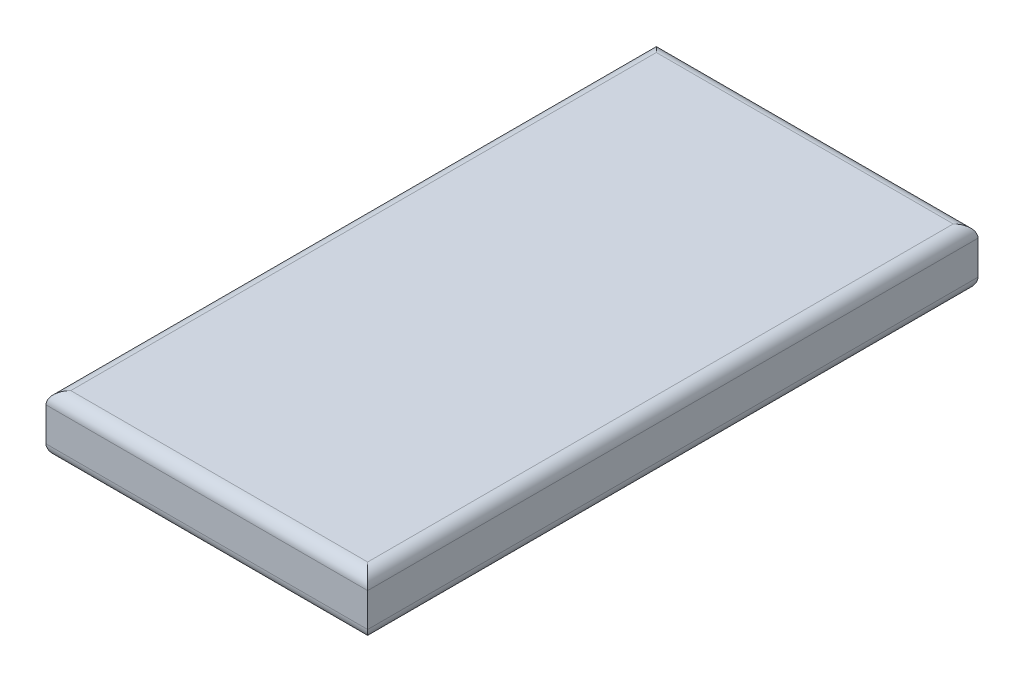
ISO-10303-21;
HEADER;
FILE_DESCRIPTION(('STEP AP214'),'2;1');
FILE_NAME('part.step','',(''),(''),'','','');
FILE_SCHEMA(('AUTOMOTIVE_DESIGN { 1 0 10303 214 1 1 1 1 }'));
ENDSEC;
DATA;
#1=APPLICATION_CONTEXT('core data for automotive mechanical design processes');
#2=APPLICATION_PROTOCOL_DEFINITION('international standard','automotive_design',2000,#1);
#3=PRODUCT_CONTEXT('',#1,'mechanical');
#4=PRODUCT('Part','Part','',(#3));
#5=PRODUCT_RELATED_PRODUCT_CATEGORY('part','',(#4));
#6=PRODUCT_DEFINITION_FORMATION('','',#4);
#7=PRODUCT_DEFINITION_CONTEXT('part definition',#1,'design');
#8=PRODUCT_DEFINITION('design','',#6,#7);
#9=PRODUCT_DEFINITION_SHAPE('','',#8);
#10=(LENGTH_UNIT() NAMED_UNIT(*) SI_UNIT(.MILLI.,.METRE.));
#11=(NAMED_UNIT(*) PLANE_ANGLE_UNIT() SI_UNIT($,.RADIAN.));
#12=(NAMED_UNIT(*) SI_UNIT($,.STERADIAN.) SOLID_ANGLE_UNIT());
#13=UNCERTAINTY_MEASURE_WITH_UNIT(LENGTH_MEASURE(1.E-05),#10,'distance_accuracy_value','');
#14=(GEOMETRIC_REPRESENTATION_CONTEXT(3) GLOBAL_UNCERTAINTY_ASSIGNED_CONTEXT((#13)) GLOBAL_UNIT_ASSIGNED_CONTEXT((#10,
#11,#12)) REPRESENTATION_CONTEXT('',''));
#15=CARTESIAN_POINT('',(0.,0.,0.));
#16=DIRECTION('',(0.,0.,1.));
#17=DIRECTION('',(1.,0.,0.));
#18=AXIS2_PLACEMENT_3D('',#15,#16,#17);
#19=CARTESIAN_POINT('',(0.,180.,0.));
#20=DIRECTION('',(1.,0.,0.));
#21=DIRECTION('',(0.,0.,-1.));
#22=AXIS2_PLACEMENT_3D('',#19,#20,#21);
#23=PLANE('',#22);
#24=DIRECTION('',(0.,-1.,0.));
#25=VECTOR('',#24,1.);
#26=CARTESIAN_POINT('',(0.,180.,-1879.6));
#27=LINE('',#26,#25);
#28=CARTESIAN_POINT('',(0.,141.9,-1879.6));
#29=VERTEX_POINT('',#28);
#30=CARTESIAN_POINT('',(0.,38.1000000000001,-1879.6));
#31=VERTEX_POINT('',#30);
#32=EDGE_CURVE('E164',#29,#31,#27,.T.);
#33=ORIENTED_EDGE('',*,*,#32,.T.);
#34=DIRECTION('',(0.,0.,1.));
#35=VECTOR('',#34,1.);
#36=CARTESIAN_POINT('',(0.,38.1,0.));
#37=LINE('',#36,#35);
#38=CARTESIAN_POINT('',(0.,38.1000000000001,0.));
#39=VERTEX_POINT('',#38);
#40=EDGE_CURVE('E118',#31,#39,#37,.T.);
#41=ORIENTED_EDGE('',*,*,#40,.T.);
#42=DIRECTION('',(0.,-1.,0.));
#43=VECTOR('',#42,1.);
#44=CARTESIAN_POINT('',(0.,180.,0.));
#45=LINE('',#44,#43);
#46=CARTESIAN_POINT('',(0.,141.9,0.));
#47=VERTEX_POINT('',#46);
#48=EDGE_CURVE('E102',#47,#39,#45,.T.);
#49=ORIENTED_EDGE('',*,*,#48,.F.);
#50=DIRECTION('',(0.,0.,1.));
#51=VECTOR('',#50,1.);
#52=CARTESIAN_POINT('',(0.,141.9,0.));
#53=LINE('',#52,#51);
#54=EDGE_CURVE('E115',#47,#29,#53,.F.);
#55=ORIENTED_EDGE('',*,*,#54,.T.);
#56=EDGE_LOOP('',(#33,#41,#49,#55));
#57=FACE_BOUND('',#56,.T.);
#58=ADVANCED_FACE('F33',(#57),#23,.F.);
#59=CARTESIAN_POINT('',(0.,180.,0.));
#60=DIRECTION('',(0.,0.,-1.));
#61=DIRECTION('',(-1.,0.,0.));
#62=AXIS2_PLACEMENT_3D('',#59,#60,#61);
#63=PLANE('',#62);
#64=ORIENTED_EDGE('',*,*,#48,.T.);
#65=DIRECTION('',(1.,0.,0.));
#66=VECTOR('',#65,1.);
#67=CARTESIAN_POINT('',(990.6,38.1,0.));
#68=LINE('',#67,#66);
#69=CARTESIAN_POINT('',(990.6,38.1000000000001,0.));
#70=VERTEX_POINT('',#69);
#71=EDGE_CURVE('E108',#39,#70,#68,.T.);
#72=ORIENTED_EDGE('',*,*,#71,.T.);
#73=DIRECTION('',(0.,-1.,0.));
#74=VECTOR('',#73,1.);
#75=CARTESIAN_POINT('',(990.6,180.,0.));
#76=LINE('',#75,#74);
#77=CARTESIAN_POINT('',(990.6,141.9,0.));
#78=VERTEX_POINT('',#77);
#79=EDGE_CURVE('E104',#78,#70,#76,.T.);
#80=ORIENTED_EDGE('',*,*,#79,.F.);
#81=DIRECTION('',(1.,0.,0.));
#82=VECTOR('',#81,1.);
#83=CARTESIAN_POINT('',(0.,141.9,0.));
#84=LINE('',#83,#82);
#85=EDGE_CURVE('E99',#78,#47,#84,.F.);
#86=ORIENTED_EDGE('',*,*,#85,.T.);
#87=EDGE_LOOP('',(#64,#72,#80,#86));
#88=FACE_BOUND('',#87,.T.);
#89=ADVANCED_FACE('F101',(#88),#63,.F.);
#90=CARTESIAN_POINT('',(990.6,180.,0.));
#91=DIRECTION('',(-1.,0.,0.));
#92=DIRECTION('',(0.,0.,1.));
#93=AXIS2_PLACEMENT_3D('',#90,#91,#92);
#94=PLANE('',#93);
#95=ORIENTED_EDGE('',*,*,#79,.T.);
#96=DIRECTION('',(0.,0.,-1.));
#97=VECTOR('',#96,1.);
#98=CARTESIAN_POINT('',(990.6,38.1,-1879.6));
#99=LINE('',#98,#97);
#100=CARTESIAN_POINT('',(990.6,38.1000000000001,-1879.6));
#101=VERTEX_POINT('',#100);
#102=EDGE_CURVE('E109',#70,#101,#99,.T.);
#103=ORIENTED_EDGE('',*,*,#102,.T.);
#104=DIRECTION('',(0.,-1.,0.));
#105=VECTOR('',#104,1.);
#106=CARTESIAN_POINT('',(990.6,180.,-1879.6));
#107=LINE('',#106,#105);
#108=CARTESIAN_POINT('',(990.6,141.9,-1879.6));
#109=VERTEX_POINT('',#108);
#110=EDGE_CURVE('E178',#109,#101,#107,.T.);
#111=ORIENTED_EDGE('',*,*,#110,.F.);
#112=DIRECTION('',(0.,0.,-1.));
#113=VECTOR('',#112,1.);
#114=CARTESIAN_POINT('',(990.6,141.9,0.));
#115=LINE('',#114,#113);
#116=EDGE_CURVE('E146',#109,#78,#115,.F.);
#117=ORIENTED_EDGE('',*,*,#116,.T.);
#118=EDGE_LOOP('',(#95,#103,#111,#117));
#119=FACE_BOUND('',#118,.T.);
#120=ADVANCED_FACE('F180',(#119),#94,.F.);
#121=CARTESIAN_POINT('',(0.,180.,-1879.6));
#122=DIRECTION('',(0.,0.,1.));
#123=DIRECTION('',(1.,0.,0.));
#124=AXIS2_PLACEMENT_3D('',#121,#122,#123);
#125=PLANE('',#124);
#126=ORIENTED_EDGE('',*,*,#110,.T.);
#127=DIRECTION('',(-1.,0.,0.));
#128=VECTOR('',#127,1.);
#129=CARTESIAN_POINT('',(0.,38.1,-1879.6));
#130=LINE('',#129,#128);
#131=EDGE_CURVE('E144',#101,#31,#130,.T.);
#132=ORIENTED_EDGE('',*,*,#131,.T.);
#133=ORIENTED_EDGE('',*,*,#32,.F.);
#134=DIRECTION('',(-1.,0.,0.));
#135=VECTOR('',#134,1.);
#136=CARTESIAN_POINT('',(0.,141.9,-1879.6));
#137=LINE('',#136,#135);
#138=EDGE_CURVE('E141',#29,#109,#137,.F.);
#139=ORIENTED_EDGE('',*,*,#138,.T.);
#140=EDGE_LOOP('',(#126,#132,#133,#139));
#141=FACE_BOUND('',#140,.T.);
#142=ADVANCED_FACE('F177',(#141),#125,.F.);
#143=CARTESIAN_POINT('',(0.,180.,0.));
#144=DIRECTION('',(0.,-1.,0.));
#145=DIRECTION('',(0.,0.,-1.));
#146=AXIS2_PLACEMENT_3D('',#143,#144,#145);
#147=PLANE('',#146);
#148=DIRECTION('',(0.,0.,-1.));
#149=VECTOR('',#148,1.);
#150=CARTESIAN_POINT('',(952.5,180.,0.));
#151=LINE('',#150,#149);
#152=CARTESIAN_POINT('',(952.5,180.,-38.1));
#153=VERTEX_POINT('',#152);
#154=CARTESIAN_POINT('',(952.5,180.,-1841.5));
#155=VERTEX_POINT('',#154);
#156=EDGE_CURVE('E42',#153,#155,#151,.T.);
#157=ORIENTED_EDGE('',*,*,#156,.T.);
#158=DIRECTION('',(-1.,0.,0.));
#159=VECTOR('',#158,1.);
#160=CARTESIAN_POINT('',(0.,180.,-1841.5));
#161=LINE('',#160,#159);
#162=CARTESIAN_POINT('',(38.1,180.,-1841.5));
#163=VERTEX_POINT('',#162);
#164=EDGE_CURVE('E11',#155,#163,#161,.T.);
#165=ORIENTED_EDGE('',*,*,#164,.T.);
#166=DIRECTION('',(0.,0.,1.));
#167=VECTOR('',#166,1.);
#168=CARTESIAN_POINT('',(38.1,180.,0.));
#169=LINE('',#168,#167);
#170=CARTESIAN_POINT('',(38.1,180.,-38.1));
#171=VERTEX_POINT('',#170);
#172=EDGE_CURVE('E150',#163,#171,#169,.T.);
#173=ORIENTED_EDGE('',*,*,#172,.T.);
#174=DIRECTION('',(1.,0.,0.));
#175=VECTOR('',#174,1.);
#176=CARTESIAN_POINT('',(0.,180.,-38.1));
#177=LINE('',#176,#175);
#178=EDGE_CURVE('E53',#171,#153,#177,.T.);
#179=ORIENTED_EDGE('',*,*,#178,.T.);
#180=EDGE_LOOP('',(#157,#165,#173,#179));
#181=FACE_BOUND('',#180,.T.);
#182=ADVANCED_FACE('F204',(#181),#147,.F.);
#183=CARTESIAN_POINT('',(0.,0.,0.));
#184=DIRECTION('',(0.,-1.,0.));
#185=DIRECTION('',(0.,0.,-1.));
#186=AXIS2_PLACEMENT_3D('',#183,#184,#185);
#187=PLANE('',#186);
#188=DIRECTION('',(1.,0.,0.));
#189=VECTOR('',#188,1.);
#190=CARTESIAN_POINT('',(0.,0.,-38.1));
#191=LINE('',#190,#189);
#192=CARTESIAN_POINT('',(952.5,0.,-38.1));
#193=VERTEX_POINT('',#192);
#194=CARTESIAN_POINT('',(38.1,0.,-38.1));
#195=VERTEX_POINT('',#194);
#196=EDGE_CURVE('E129',#193,#195,#191,.F.);
#197=ORIENTED_EDGE('',*,*,#196,.T.);
#198=DIRECTION('',(0.,0.,1.));
#199=VECTOR('',#198,1.);
#200=CARTESIAN_POINT('',(38.1,0.,-1879.6));
#201=LINE('',#200,#199);
#202=CARTESIAN_POINT('',(38.1,0.,-1841.5));
#203=VERTEX_POINT('',#202);
#204=EDGE_CURVE('E138',#195,#203,#201,.F.);
#205=ORIENTED_EDGE('',*,*,#204,.T.);
#206=DIRECTION('',(-1.,0.,0.));
#207=VECTOR('',#206,1.);
#208=CARTESIAN_POINT('',(990.6,0.,-1841.5));
#209=LINE('',#208,#207);
#210=CARTESIAN_POINT('',(952.5,0.,-1841.5));
#211=VERTEX_POINT('',#210);
#212=EDGE_CURVE('E136',#203,#211,#209,.F.);
#213=ORIENTED_EDGE('',*,*,#212,.T.);
#214=DIRECTION('',(0.,0.,-1.));
#215=VECTOR('',#214,1.);
#216=CARTESIAN_POINT('',(952.5,0.,0.));
#217=LINE('',#216,#215);
#218=EDGE_CURVE('E134',#211,#193,#217,.F.);
#219=ORIENTED_EDGE('',*,*,#218,.T.);
#220=EDGE_LOOP('',(#197,#205,#213,#219));
#221=FACE_BOUND('',#220,.T.);
#222=ADVANCED_FACE('F202',(#221),#187,.T.);
#223=CARTESIAN_POINT('',(952.5,38.1,0.));
#224=DIRECTION('',(0.,0.,1.));
#225=DIRECTION('',(1.,0.,0.));
#226=AXIS2_PLACEMENT_3D('',#223,#224,#225);
#227=CYLINDRICAL_SURFACE('',#226,38.1);
#228=CARTESIAN_POINT('',(952.5,38.1,-38.1));
#229=DIRECTION('',(-0.707106781186547,0.,0.707106781186547));
#230=DIRECTION('',(-0.707106781186547,0.,-0.707106781186547));
#231=AXIS2_PLACEMENT_3D('',#228,#229,#230);
#232=ELLIPSE('',#231,53.8815367264149,38.1);
#233=EDGE_CURVE('E158',#193,#70,#232,.T.);
#234=ORIENTED_EDGE('',*,*,#233,.F.);
#235=ORIENTED_EDGE('',*,*,#218,.F.);
#236=CARTESIAN_POINT('',(952.5,38.1,-1841.5));
#237=DIRECTION('',(0.707106781186547,0.,0.707106781186547));
#238=DIRECTION('',(-0.707106781186547,0.,0.707106781186547));
#239=AXIS2_PLACEMENT_3D('',#236,#237,#238);
#240=ELLIPSE('',#239,53.8815367264149,38.1);
#241=EDGE_CURVE('E161',#101,#211,#240,.F.);
#242=ORIENTED_EDGE('',*,*,#241,.F.);
#243=ORIENTED_EDGE('',*,*,#102,.F.);
#244=EDGE_LOOP('',(#234,#235,#242,#243));
#245=FACE_BOUND('',#244,.T.);
#246=ADVANCED_FACE('F199',(#245),#227,.T.);
#247=CARTESIAN_POINT('',(0.,38.1,-1841.5));
#248=DIRECTION('',(1.,0.,0.));
#249=DIRECTION('',(0.,0.,-1.));
#250=AXIS2_PLACEMENT_3D('',#247,#248,#249);
#251=CYLINDRICAL_SURFACE('',#250,38.1);
#252=ORIENTED_EDGE('',*,*,#241,.T.);
#253=ORIENTED_EDGE('',*,*,#212,.F.);
#254=CARTESIAN_POINT('',(38.1,38.1,-1841.5));
#255=DIRECTION('',(0.707106781186547,0.,-0.707106781186547));
#256=DIRECTION('',(0.707106781186547,0.,0.707106781186547));
#257=AXIS2_PLACEMENT_3D('',#254,#255,#256);
#258=ELLIPSE('',#257,53.8815367264149,38.1);
#259=EDGE_CURVE('E156',#31,#203,#258,.F.);
#260=ORIENTED_EDGE('',*,*,#259,.F.);
#261=ORIENTED_EDGE('',*,*,#131,.F.);
#262=EDGE_LOOP('',(#252,#253,#260,#261));
#263=FACE_BOUND('',#262,.T.);
#264=ADVANCED_FACE('F188',(#263),#251,.T.);
#265=CARTESIAN_POINT('',(0.,38.1,-38.1));
#266=DIRECTION('',(-1.,0.,0.));
#267=DIRECTION('',(0.,0.,1.));
#268=AXIS2_PLACEMENT_3D('',#265,#266,#267);
#269=CYLINDRICAL_SURFACE('',#268,38.1);
#270=ORIENTED_EDGE('',*,*,#233,.T.);
#271=ORIENTED_EDGE('',*,*,#71,.F.);
#272=CARTESIAN_POINT('',(38.1,38.1,-38.1));
#273=DIRECTION('',(-0.707106781186547,0.,-0.707106781186547));
#274=DIRECTION('',(-0.707106781186547,0.,0.707106781186547));
#275=AXIS2_PLACEMENT_3D('',#272,#273,#274);
#276=ELLIPSE('',#275,53.8815367264149,38.1);
#277=EDGE_CURVE('E154',#195,#39,#276,.T.);
#278=ORIENTED_EDGE('',*,*,#277,.F.);
#279=ORIENTED_EDGE('',*,*,#196,.F.);
#280=EDGE_LOOP('',(#270,#271,#278,#279));
#281=FACE_BOUND('',#280,.T.);
#282=ADVANCED_FACE('F196',(#281),#269,.T.);
#283=CARTESIAN_POINT('',(38.1,38.1,0.));
#284=DIRECTION('',(0.,0.,-1.));
#285=DIRECTION('',(-1.,0.,0.));
#286=AXIS2_PLACEMENT_3D('',#283,#284,#285);
#287=CYLINDRICAL_SURFACE('',#286,38.1);
#288=ORIENTED_EDGE('',*,*,#259,.T.);
#289=ORIENTED_EDGE('',*,*,#204,.F.);
#290=ORIENTED_EDGE('',*,*,#277,.T.);
#291=ORIENTED_EDGE('',*,*,#40,.F.);
#292=EDGE_LOOP('',(#288,#289,#290,#291));
#293=FACE_BOUND('',#292,.T.);
#294=ADVANCED_FACE('F191',(#293),#287,.T.);
#295=CARTESIAN_POINT('',(0.,141.9,-38.1));
#296=DIRECTION('',(1.,0.,0.));
#297=DIRECTION('',(0.,0.,-1.));
#298=AXIS2_PLACEMENT_3D('',#295,#296,#297);
#299=CYLINDRICAL_SURFACE('',#298,38.1);
#300=CARTESIAN_POINT('',(38.1,141.9,-38.1));
#301=DIRECTION('',(0.707106781186547,0.,0.707106781186547));
#302=DIRECTION('',(-0.707106781186547,0.,0.707106781186547));
#303=AXIS2_PLACEMENT_3D('',#300,#301,#302);
#304=ELLIPSE('',#303,53.8815367264149,38.1);
#305=EDGE_CURVE('E121',#47,#171,#304,.F.);
#306=ORIENTED_EDGE('',*,*,#305,.F.);
#307=ORIENTED_EDGE('',*,*,#85,.F.);
#308=CARTESIAN_POINT('',(952.5,141.9,-38.1));
#309=DIRECTION('',(0.707106781186547,0.,-0.707106781186547));
#310=DIRECTION('',(0.707106781186547,0.,0.707106781186547));
#311=AXIS2_PLACEMENT_3D('',#308,#309,#310);
#312=ELLIPSE('',#311,53.8815367264149,38.1);
#313=EDGE_CURVE('E37',#153,#78,#312,.T.);
#314=ORIENTED_EDGE('',*,*,#313,.F.);
#315=ORIENTED_EDGE('',*,*,#178,.F.);
#316=EDGE_LOOP('',(#306,#307,#314,#315));
#317=FACE_BOUND('',#316,.T.);
#318=ADVANCED_FACE('F35',(#317),#299,.T.);
#319=CARTESIAN_POINT('',(952.5,141.9,0.));
#320=DIRECTION('',(0.,0.,-1.));
#321=DIRECTION('',(-1.,0.,0.));
#322=AXIS2_PLACEMENT_3D('',#319,#320,#321);
#323=CYLINDRICAL_SURFACE('',#322,38.1);
#324=ORIENTED_EDGE('',*,*,#313,.T.);
#325=ORIENTED_EDGE('',*,*,#116,.F.);
#326=CARTESIAN_POINT('',(952.5,141.9,-1841.5));
#327=DIRECTION('',(-0.707106781186547,0.,-0.707106781186547));
#328=DIRECTION('',(0.707106781186547,0.,-0.707106781186547));
#329=AXIS2_PLACEMENT_3D('',#326,#327,#328);
#330=ELLIPSE('',#329,53.8815367264149,38.1);
#331=EDGE_CURVE('E124',#155,#109,#330,.T.);
#332=ORIENTED_EDGE('',*,*,#331,.F.);
#333=ORIENTED_EDGE('',*,*,#156,.F.);
#334=EDGE_LOOP('',(#324,#325,#332,#333));
#335=FACE_BOUND('',#334,.T.);
#336=ADVANCED_FACE('F172',(#335),#323,.T.);
#337=CARTESIAN_POINT('',(38.1,141.9,0.));
#338=DIRECTION('',(0.,0.,1.));
#339=DIRECTION('',(1.,0.,0.));
#340=AXIS2_PLACEMENT_3D('',#337,#338,#339);
#341=CYLINDRICAL_SURFACE('',#340,38.1);
#342=ORIENTED_EDGE('',*,*,#305,.T.);
#343=ORIENTED_EDGE('',*,*,#172,.F.);
#344=CARTESIAN_POINT('',(38.1,141.9,-1841.5));
#345=DIRECTION('',(-0.707106781186547,0.,0.707106781186547));
#346=DIRECTION('',(0.707106781186547,0.,0.707106781186547));
#347=AXIS2_PLACEMENT_3D('',#344,#345,#346);
#348=ELLIPSE('',#347,53.8815367264149,38.1);
#349=EDGE_CURVE('E127',#29,#163,#348,.F.);
#350=ORIENTED_EDGE('',*,*,#349,.F.);
#351=ORIENTED_EDGE('',*,*,#54,.F.);
#352=EDGE_LOOP('',(#342,#343,#350,#351));
#353=FACE_BOUND('',#352,.T.);
#354=ADVANCED_FACE('F126',(#353),#341,.T.);
#355=CARTESIAN_POINT('',(0.,141.9,-1841.5));
#356=DIRECTION('',(-1.,0.,0.));
#357=DIRECTION('',(0.,0.,1.));
#358=AXIS2_PLACEMENT_3D('',#355,#356,#357);
#359=CYLINDRICAL_SURFACE('',#358,38.1);
#360=ORIENTED_EDGE('',*,*,#331,.T.);
#361=ORIENTED_EDGE('',*,*,#138,.F.);
#362=ORIENTED_EDGE('',*,*,#349,.T.);
#363=ORIENTED_EDGE('',*,*,#164,.F.);
#364=EDGE_LOOP('',(#360,#361,#362,#363));
#365=FACE_BOUND('',#364,.T.);
#366=ADVANCED_FACE('F170',(#365),#359,.T.);
#367=CLOSED_SHELL('',(#58,#89,#120,#142,#182,#222,#246,#264,#282,#294,#318,#336,#354,#366));
#368=MANIFOLD_SOLID_BREP('B2',#367);
#369=ADVANCED_BREP_SHAPE_REPRESENTATION('',(#18,#368),#14);
#370=SHAPE_DEFINITION_REPRESENTATION(#9,#369);
ENDSEC;
END-ISO-10303-21;
